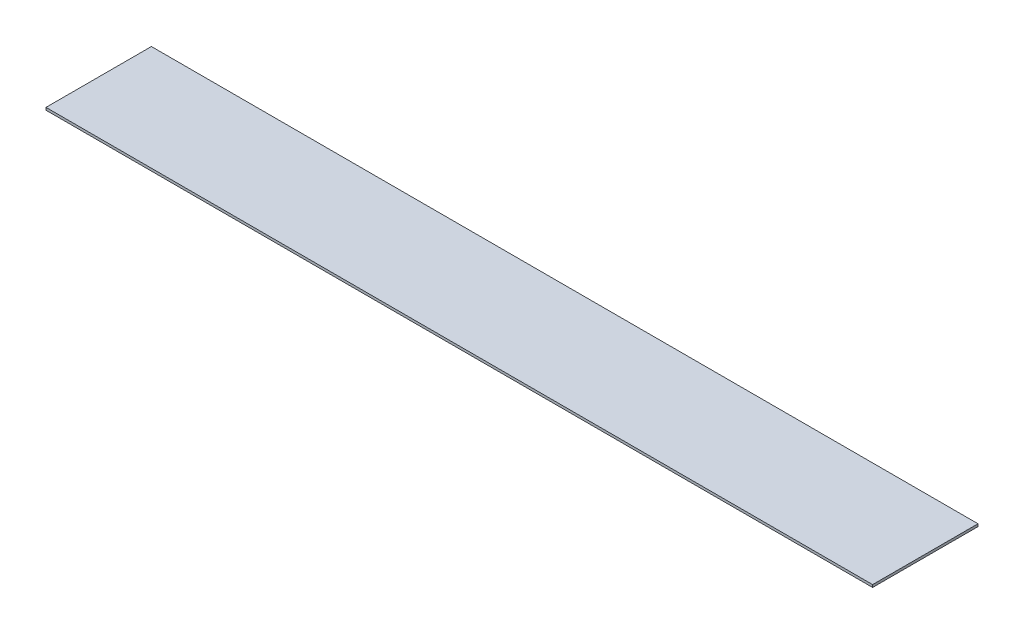
ISO-10303-21;
HEADER;
FILE_DESCRIPTION(('STEP AP214'),'2;1');
FILE_NAME('part.step','',(''),(''),'','','');
FILE_SCHEMA(('AUTOMOTIVE_DESIGN { 1 0 10303 214 1 1 1 1 }'));
ENDSEC;
DATA;
#1=APPLICATION_CONTEXT('core data for automotive mechanical design processes');
#2=APPLICATION_PROTOCOL_DEFINITION('international standard','automotive_design',2000,#1);
#3=PRODUCT_CONTEXT('',#1,'mechanical');
#4=PRODUCT('Part','Part','',(#3));
#5=PRODUCT_RELATED_PRODUCT_CATEGORY('part','',(#4));
#6=PRODUCT_DEFINITION_FORMATION('','',#4);
#7=PRODUCT_DEFINITION_CONTEXT('part definition',#1,'design');
#8=PRODUCT_DEFINITION('design','',#6,#7);
#9=PRODUCT_DEFINITION_SHAPE('','',#8);
#10=(LENGTH_UNIT() NAMED_UNIT(*) SI_UNIT(.MILLI.,.METRE.));
#11=(NAMED_UNIT(*) PLANE_ANGLE_UNIT() SI_UNIT($,.RADIAN.));
#12=(NAMED_UNIT(*) SI_UNIT($,.STERADIAN.) SOLID_ANGLE_UNIT());
#13=UNCERTAINTY_MEASURE_WITH_UNIT(LENGTH_MEASURE(1.E-05),#10,'distance_accuracy_value','');
#14=(GEOMETRIC_REPRESENTATION_CONTEXT(3) GLOBAL_UNCERTAINTY_ASSIGNED_CONTEXT((#13)) GLOBAL_UNIT_ASSIGNED_CONTEXT((#10,
#11,#12)) REPRESENTATION_CONTEXT('',''));
#15=CARTESIAN_POINT('',(0.,0.,0.));
#16=DIRECTION('',(0.,0.,1.));
#17=DIRECTION('',(1.,0.,0.));
#18=AXIS2_PLACEMENT_3D('',#15,#16,#17);
#19=CARTESIAN_POINT('',(82.55,0.25,-10.525));
#20=DIRECTION('',(-1.,0.,0.));
#21=DIRECTION('',(0.,0.,1.));
#22=AXIS2_PLACEMENT_3D('',#19,#20,#21);
#23=PLANE('',#22);
#24=DIRECTION('',(0.,0.,-1.));
#25=VECTOR('',#24,1.);
#26=CARTESIAN_POINT('',(82.55,-0.25,-10.525));
#27=LINE('',#26,#25);
#28=CARTESIAN_POINT('',(82.55,-0.25,10.525));
#29=VERTEX_POINT('',#28);
#30=CARTESIAN_POINT('',(82.55,-0.25,-10.525));
#31=VERTEX_POINT('',#30);
#32=EDGE_CURVE('E105',#29,#31,#27,.T.);
#33=ORIENTED_EDGE('',*,*,#32,.T.);
#34=DIRECTION('',(0.,-1.,0.));
#35=VECTOR('',#34,1.);
#36=CARTESIAN_POINT('',(82.55,0.25,-10.525));
#37=LINE('',#36,#35);
#38=CARTESIAN_POINT('',(82.55,0.25,-10.525));
#39=VERTEX_POINT('',#38);
#40=EDGE_CURVE('E11',#39,#31,#37,.T.);
#41=ORIENTED_EDGE('',*,*,#40,.F.);
#42=DIRECTION('',(0.,0.,-1.));
#43=VECTOR('',#42,1.);
#44=CARTESIAN_POINT('',(82.55,0.25,-10.525));
#45=LINE('',#44,#43);
#46=CARTESIAN_POINT('',(82.55,0.25,10.525));
#47=VERTEX_POINT('',#46);
#48=EDGE_CURVE('E93',#47,#39,#45,.T.);
#49=ORIENTED_EDGE('',*,*,#48,.F.);
#50=DIRECTION('',(0.,-1.,0.));
#51=VECTOR('',#50,1.);
#52=CARTESIAN_POINT('',(82.55,0.25,10.525));
#53=LINE('',#52,#51);
#54=EDGE_CURVE('E101',#47,#29,#53,.T.);
#55=ORIENTED_EDGE('',*,*,#54,.T.);
#56=EDGE_LOOP('',(#33,#41,#49,#55));
#57=FACE_BOUND('',#56,.T.);
#58=ADVANCED_FACE('F42',(#57),#23,.F.);
#59=CARTESIAN_POINT('',(-82.55,0.25,-10.525));
#60=DIRECTION('',(0.,0.,1.));
#61=DIRECTION('',(1.,0.,0.));
#62=AXIS2_PLACEMENT_3D('',#59,#60,#61);
#63=PLANE('',#62);
#64=DIRECTION('',(-1.,0.,0.));
#65=VECTOR('',#64,1.);
#66=CARTESIAN_POINT('',(-82.55,-0.25,-10.525));
#67=LINE('',#66,#65);
#68=CARTESIAN_POINT('',(-82.55,-0.25,-10.525));
#69=VERTEX_POINT('',#68);
#70=EDGE_CURVE('E97',#31,#69,#67,.T.);
#71=ORIENTED_EDGE('',*,*,#70,.T.);
#72=DIRECTION('',(0.,-1.,0.));
#73=VECTOR('',#72,1.);
#74=CARTESIAN_POINT('',(-82.55,0.25,-10.525));
#75=LINE('',#74,#73);
#76=CARTESIAN_POINT('',(-82.55,0.25,-10.525));
#77=VERTEX_POINT('',#76);
#78=EDGE_CURVE('E50',#77,#69,#75,.T.);
#79=ORIENTED_EDGE('',*,*,#78,.F.);
#80=DIRECTION('',(-1.,0.,0.));
#81=VECTOR('',#80,1.);
#82=CARTESIAN_POINT('',(-82.55,0.25,-10.525));
#83=LINE('',#82,#81);
#84=EDGE_CURVE('E88',#39,#77,#83,.T.);
#85=ORIENTED_EDGE('',*,*,#84,.F.);
#86=ORIENTED_EDGE('',*,*,#40,.T.);
#87=EDGE_LOOP('',(#71,#79,#85,#86));
#88=FACE_BOUND('',#87,.T.);
#89=ADVANCED_FACE('F96',(#88),#63,.F.);
#90=CARTESIAN_POINT('',(-82.55,0.25,-10.525));
#91=DIRECTION('',(1.,0.,0.));
#92=DIRECTION('',(0.,0.,-1.));
#93=AXIS2_PLACEMENT_3D('',#90,#91,#92);
#94=PLANE('',#93);
#95=DIRECTION('',(0.,0.,1.));
#96=VECTOR('',#95,1.);
#97=CARTESIAN_POINT('',(-82.55,-0.25,-10.525));
#98=LINE('',#97,#96);
#99=CARTESIAN_POINT('',(-82.55,-0.25,10.525));
#100=VERTEX_POINT('',#99);
#101=EDGE_CURVE('E75',#69,#100,#98,.T.);
#102=ORIENTED_EDGE('',*,*,#101,.T.);
#103=DIRECTION('',(0.,-1.,0.));
#104=VECTOR('',#103,1.);
#105=CARTESIAN_POINT('',(-82.55,0.25,10.525));
#106=LINE('',#105,#104);
#107=CARTESIAN_POINT('',(-82.55,0.25,10.525));
#108=VERTEX_POINT('',#107);
#109=EDGE_CURVE('E98',#108,#100,#106,.T.);
#110=ORIENTED_EDGE('',*,*,#109,.F.);
#111=DIRECTION('',(0.,0.,1.));
#112=VECTOR('',#111,1.);
#113=CARTESIAN_POINT('',(-82.55,0.25,-10.525));
#114=LINE('',#113,#112);
#115=EDGE_CURVE('E91',#77,#108,#114,.T.);
#116=ORIENTED_EDGE('',*,*,#115,.F.);
#117=ORIENTED_EDGE('',*,*,#78,.T.);
#118=EDGE_LOOP('',(#102,#110,#116,#117));
#119=FACE_BOUND('',#118,.T.);
#120=ADVANCED_FACE('F99',(#119),#94,.F.);
#121=CARTESIAN_POINT('',(-82.55,0.25,10.525));
#122=DIRECTION('',(0.,0.,-1.));
#123=DIRECTION('',(-1.,0.,0.));
#124=AXIS2_PLACEMENT_3D('',#121,#122,#123);
#125=PLANE('',#124);
#126=DIRECTION('',(1.,0.,0.));
#127=VECTOR('',#126,1.);
#128=CARTESIAN_POINT('',(-82.55,-0.25,10.525));
#129=LINE('',#128,#127);
#130=EDGE_CURVE('E81',#100,#29,#129,.T.);
#131=ORIENTED_EDGE('',*,*,#130,.T.);
#132=ORIENTED_EDGE('',*,*,#54,.F.);
#133=DIRECTION('',(1.,0.,0.));
#134=VECTOR('',#133,1.);
#135=CARTESIAN_POINT('',(-82.55,0.25,10.525));
#136=LINE('',#135,#134);
#137=EDGE_CURVE('E58',#108,#47,#136,.T.);
#138=ORIENTED_EDGE('',*,*,#137,.F.);
#139=ORIENTED_EDGE('',*,*,#109,.T.);
#140=EDGE_LOOP('',(#131,#132,#138,#139));
#141=FACE_BOUND('',#140,.T.);
#142=ADVANCED_FACE('F112',(#141),#125,.F.);
#143=CARTESIAN_POINT('',(0.,0.25,0.));
#144=DIRECTION('',(0.,1.,0.));
#145=DIRECTION('',(0.,0.,1.));
#146=AXIS2_PLACEMENT_3D('',#143,#144,#145);
#147=PLANE('',#146);
#148=ORIENTED_EDGE('',*,*,#48,.T.);
#149=ORIENTED_EDGE('',*,*,#84,.T.);
#150=ORIENTED_EDGE('',*,*,#115,.T.);
#151=ORIENTED_EDGE('',*,*,#137,.T.);
#152=EDGE_LOOP('',(#148,#149,#150,#151));
#153=FACE_BOUND('',#152,.T.);
#154=ADVANCED_FACE('F89',(#153),#147,.T.);
#155=CARTESIAN_POINT('',(0.,-0.25,0.));
#156=DIRECTION('',(0.,1.,0.));
#157=DIRECTION('',(0.,0.,1.));
#158=AXIS2_PLACEMENT_3D('',#155,#156,#157);
#159=PLANE('',#158);
#160=ORIENTED_EDGE('',*,*,#32,.F.);
#161=ORIENTED_EDGE('',*,*,#130,.F.);
#162=ORIENTED_EDGE('',*,*,#101,.F.);
#163=ORIENTED_EDGE('',*,*,#70,.F.);
#164=EDGE_LOOP('',(#160,#161,#162,#163));
#165=FACE_BOUND('',#164,.T.);
#166=ADVANCED_FACE('F115',(#165),#159,.F.);
#167=CLOSED_SHELL('',(#58,#89,#120,#142,#154,#166));
#168=MANIFOLD_SOLID_BREP('B2',#167);
#169=ADVANCED_BREP_SHAPE_REPRESENTATION('',(#18,#168),#14);
#170=SHAPE_DEFINITION_REPRESENTATION(#9,#169);
ENDSEC;
END-ISO-10303-21;
